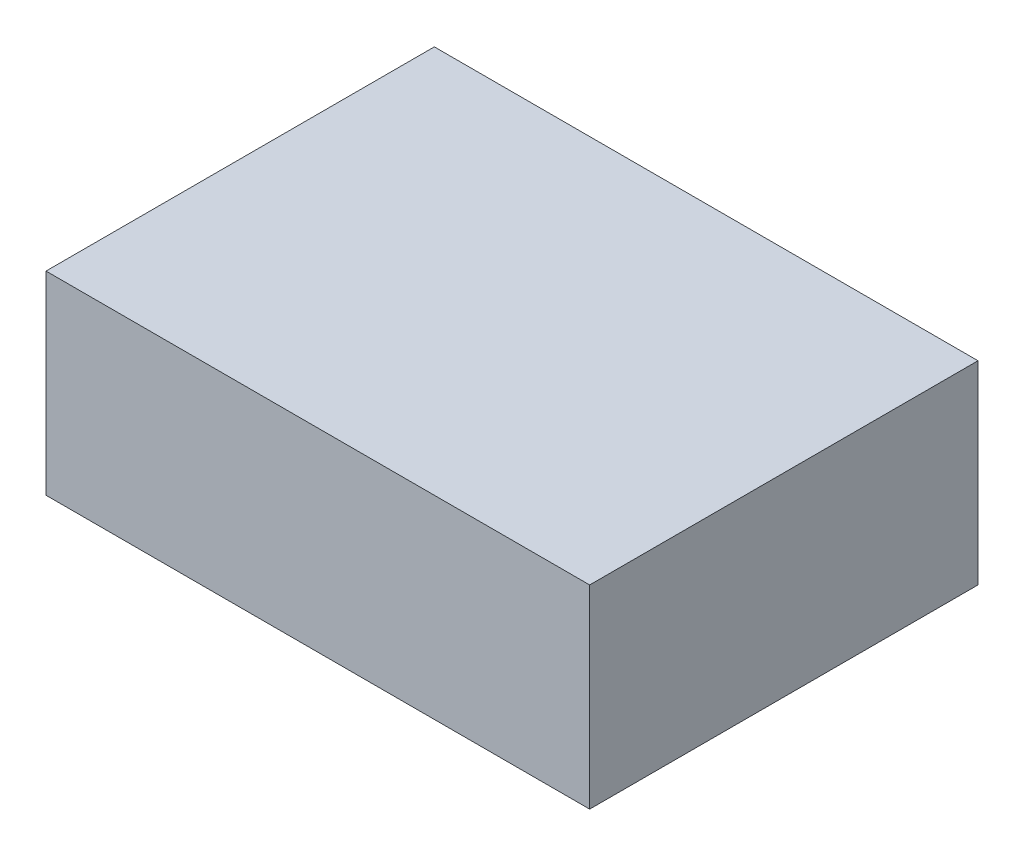
ISO-10303-21;
HEADER;
FILE_DESCRIPTION(('STEP AP214'),'2;1');
FILE_NAME('part.step','',(''),(''),'','','');
FILE_SCHEMA(('AUTOMOTIVE_DESIGN { 1 0 10303 214 1 1 1 1 }'));
ENDSEC;
DATA;
#1=APPLICATION_CONTEXT('core data for automotive mechanical design processes');
#2=APPLICATION_PROTOCOL_DEFINITION('international standard','automotive_design',2000,#1);
#3=PRODUCT_CONTEXT('',#1,'mechanical');
#4=PRODUCT('Part','Part','',(#3));
#5=PRODUCT_RELATED_PRODUCT_CATEGORY('part','',(#4));
#6=PRODUCT_DEFINITION_FORMATION('','',#4);
#7=PRODUCT_DEFINITION_CONTEXT('part definition',#1,'design');
#8=PRODUCT_DEFINITION('design','',#6,#7);
#9=PRODUCT_DEFINITION_SHAPE('','',#8);
#10=(LENGTH_UNIT() NAMED_UNIT(*) SI_UNIT(.MILLI.,.METRE.));
#11=(NAMED_UNIT(*) PLANE_ANGLE_UNIT() SI_UNIT($,.RADIAN.));
#12=(NAMED_UNIT(*) SI_UNIT($,.STERADIAN.) SOLID_ANGLE_UNIT());
#13=UNCERTAINTY_MEASURE_WITH_UNIT(LENGTH_MEASURE(1.E-05),#10,'distance_accuracy_value','');
#14=(GEOMETRIC_REPRESENTATION_CONTEXT(3) GLOBAL_UNCERTAINTY_ASSIGNED_CONTEXT((#13)) GLOBAL_UNIT_ASSIGNED_CONTEXT((#10,
#11,#12)) REPRESENTATION_CONTEXT('',''));
#15=CARTESIAN_POINT('',(0.,0.,0.));
#16=DIRECTION('',(0.,0.,1.));
#17=DIRECTION('',(1.,0.,0.));
#18=AXIS2_PLACEMENT_3D('',#15,#16,#17);
#19=CARTESIAN_POINT('',(0.7,0.5,0.5));
#20=DIRECTION('',(-1.,0.,0.));
#21=DIRECTION('',(0.,0.,1.));
#22=AXIS2_PLACEMENT_3D('',#19,#20,#21);
#23=PLANE('',#22);
#24=DIRECTION('',(0.,0.,-1.));
#25=VECTOR('',#24,1.);
#26=CARTESIAN_POINT('',(0.7,0.,0.5));
#27=LINE('',#26,#25);
#28=CARTESIAN_POINT('',(0.7,0.,0.5));
#29=VERTEX_POINT('',#28);
#30=CARTESIAN_POINT('',(0.7,0.,-0.5));
#31=VERTEX_POINT('',#30);
#32=EDGE_CURVE('E96',#29,#31,#27,.T.);
#33=ORIENTED_EDGE('',*,*,#32,.T.);
#34=DIRECTION('',(0.,-1.,0.));
#35=VECTOR('',#34,1.);
#36=CARTESIAN_POINT('',(0.7,0.5,-0.5));
#37=LINE('',#36,#35);
#38=CARTESIAN_POINT('',(0.7,0.5,-0.5));
#39=VERTEX_POINT('',#38);
#40=EDGE_CURVE('E11',#39,#31,#37,.T.);
#41=ORIENTED_EDGE('',*,*,#40,.F.);
#42=DIRECTION('',(0.,0.,-1.));
#43=VECTOR('',#42,1.);
#44=CARTESIAN_POINT('',(0.7,0.5,0.5));
#45=LINE('',#44,#43);
#46=CARTESIAN_POINT('',(0.7,0.5,0.5));
#47=VERTEX_POINT('',#46);
#48=EDGE_CURVE('E84',#47,#39,#45,.T.);
#49=ORIENTED_EDGE('',*,*,#48,.F.);
#50=DIRECTION('',(0.,-1.,0.));
#51=VECTOR('',#50,1.);
#52=CARTESIAN_POINT('',(0.7,0.5,0.5));
#53=LINE('',#52,#51);
#54=EDGE_CURVE('E92',#47,#29,#53,.T.);
#55=ORIENTED_EDGE('',*,*,#54,.T.);
#56=EDGE_LOOP('',(#33,#41,#49,#55));
#57=FACE_BOUND('',#56,.T.);
#58=ADVANCED_FACE('F33',(#57),#23,.F.);
#59=CARTESIAN_POINT('',(-0.7,0.5,-0.5));
#60=DIRECTION('',(0.,0.,1.));
#61=DIRECTION('',(1.,0.,0.));
#62=AXIS2_PLACEMENT_3D('',#59,#60,#61);
#63=PLANE('',#62);
#64=DIRECTION('',(-1.,0.,0.));
#65=VECTOR('',#64,1.);
#66=CARTESIAN_POINT('',(-0.7,0.,-0.5));
#67=LINE('',#66,#65);
#68=CARTESIAN_POINT('',(-0.7,0.,-0.5));
#69=VERTEX_POINT('',#68);
#70=EDGE_CURVE('E88',#31,#69,#67,.T.);
#71=ORIENTED_EDGE('',*,*,#70,.T.);
#72=DIRECTION('',(0.,-1.,0.));
#73=VECTOR('',#72,1.);
#74=CARTESIAN_POINT('',(-0.7,0.5,-0.5));
#75=LINE('',#74,#73);
#76=CARTESIAN_POINT('',(-0.7,0.5,-0.5));
#77=VERTEX_POINT('',#76);
#78=EDGE_CURVE('E41',#77,#69,#75,.T.);
#79=ORIENTED_EDGE('',*,*,#78,.F.);
#80=DIRECTION('',(-1.,0.,0.));
#81=VECTOR('',#80,1.);
#82=CARTESIAN_POINT('',(-0.7,0.5,-0.5));
#83=LINE('',#82,#81);
#84=EDGE_CURVE('E79',#39,#77,#83,.T.);
#85=ORIENTED_EDGE('',*,*,#84,.F.);
#86=ORIENTED_EDGE('',*,*,#40,.T.);
#87=EDGE_LOOP('',(#71,#79,#85,#86));
#88=FACE_BOUND('',#87,.T.);
#89=ADVANCED_FACE('F87',(#88),#63,.F.);
#90=CARTESIAN_POINT('',(-0.7,0.5,0.5));
#91=DIRECTION('',(1.,0.,0.));
#92=DIRECTION('',(0.,0.,-1.));
#93=AXIS2_PLACEMENT_3D('',#90,#91,#92);
#94=PLANE('',#93);
#95=DIRECTION('',(0.,0.,1.));
#96=VECTOR('',#95,1.);
#97=CARTESIAN_POINT('',(-0.7,0.,0.5));
#98=LINE('',#97,#96);
#99=CARTESIAN_POINT('',(-0.7,0.,0.5));
#100=VERTEX_POINT('',#99);
#101=EDGE_CURVE('E66',#69,#100,#98,.T.);
#102=ORIENTED_EDGE('',*,*,#101,.T.);
#103=DIRECTION('',(0.,-1.,0.));
#104=VECTOR('',#103,1.);
#105=CARTESIAN_POINT('',(-0.7,0.5,0.5));
#106=LINE('',#105,#104);
#107=CARTESIAN_POINT('',(-0.7,0.5,0.5));
#108=VERTEX_POINT('',#107);
#109=EDGE_CURVE('E89',#108,#100,#106,.T.);
#110=ORIENTED_EDGE('',*,*,#109,.F.);
#111=DIRECTION('',(0.,0.,1.));
#112=VECTOR('',#111,1.);
#113=CARTESIAN_POINT('',(-0.7,0.5,0.5));
#114=LINE('',#113,#112);
#115=EDGE_CURVE('E82',#77,#108,#114,.T.);
#116=ORIENTED_EDGE('',*,*,#115,.F.);
#117=ORIENTED_EDGE('',*,*,#78,.T.);
#118=EDGE_LOOP('',(#102,#110,#116,#117));
#119=FACE_BOUND('',#118,.T.);
#120=ADVANCED_FACE('F90',(#119),#94,.F.);
#121=CARTESIAN_POINT('',(-0.7,0.5,0.5));
#122=DIRECTION('',(0.,0.,-1.));
#123=DIRECTION('',(-1.,0.,0.));
#124=AXIS2_PLACEMENT_3D('',#121,#122,#123);
#125=PLANE('',#124);
#126=DIRECTION('',(1.,0.,0.));
#127=VECTOR('',#126,1.);
#128=CARTESIAN_POINT('',(-0.7,0.,0.5));
#129=LINE('',#128,#127);
#130=EDGE_CURVE('E72',#100,#29,#129,.T.);
#131=ORIENTED_EDGE('',*,*,#130,.T.);
#132=ORIENTED_EDGE('',*,*,#54,.F.);
#133=DIRECTION('',(1.,0.,0.));
#134=VECTOR('',#133,1.);
#135=CARTESIAN_POINT('',(-0.7,0.5,0.5));
#136=LINE('',#135,#134);
#137=EDGE_CURVE('E49',#108,#47,#136,.T.);
#138=ORIENTED_EDGE('',*,*,#137,.F.);
#139=ORIENTED_EDGE('',*,*,#109,.T.);
#140=EDGE_LOOP('',(#131,#132,#138,#139));
#141=FACE_BOUND('',#140,.T.);
#142=ADVANCED_FACE('F103',(#141),#125,.F.);
#143=CARTESIAN_POINT('',(0.,0.5,0.));
#144=DIRECTION('',(0.,-1.,0.));
#145=DIRECTION('',(0.,0.,-1.));
#146=AXIS2_PLACEMENT_3D('',#143,#144,#145);
#147=PLANE('',#146);
#148=ORIENTED_EDGE('',*,*,#48,.T.);
#149=ORIENTED_EDGE('',*,*,#84,.T.);
#150=ORIENTED_EDGE('',*,*,#115,.T.);
#151=ORIENTED_EDGE('',*,*,#137,.T.);
#152=EDGE_LOOP('',(#148,#149,#150,#151));
#153=FACE_BOUND('',#152,.T.);
#154=ADVANCED_FACE('F80',(#153),#147,.F.);
#155=CARTESIAN_POINT('',(0.,0.,0.));
#156=DIRECTION('',(0.,-1.,0.));
#157=DIRECTION('',(0.,0.,-1.));
#158=AXIS2_PLACEMENT_3D('',#155,#156,#157);
#159=PLANE('',#158);
#160=ORIENTED_EDGE('',*,*,#32,.F.);
#161=ORIENTED_EDGE('',*,*,#130,.F.);
#162=ORIENTED_EDGE('',*,*,#101,.F.);
#163=ORIENTED_EDGE('',*,*,#70,.F.);
#164=EDGE_LOOP('',(#160,#161,#162,#163));
#165=FACE_BOUND('',#164,.T.);
#166=ADVANCED_FACE('F106',(#165),#159,.T.);
#167=CLOSED_SHELL('',(#58,#89,#120,#142,#154,#166));
#168=MANIFOLD_SOLID_BREP('B2',#167);
#169=ADVANCED_BREP_SHAPE_REPRESENTATION('',(#18,#168),#14);
#170=SHAPE_DEFINITION_REPRESENTATION(#9,#169);
ENDSEC;
END-ISO-10303-21;
